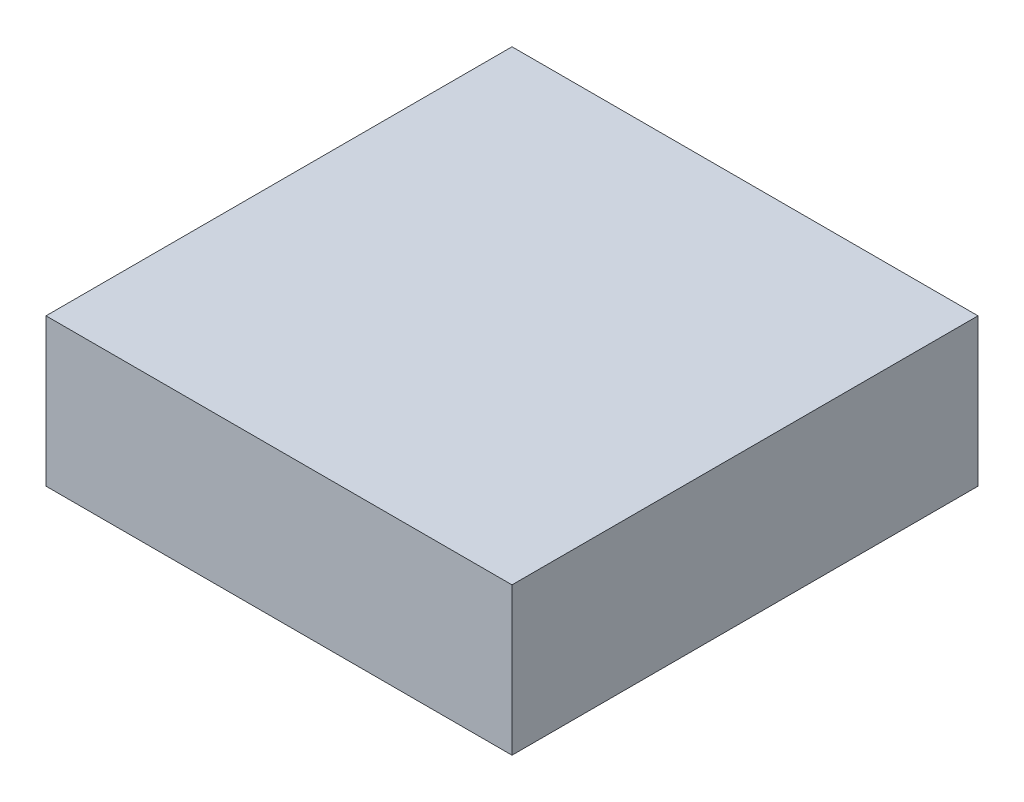
ISO-10303-21;
HEADER;
FILE_DESCRIPTION(('STEP AP214'),'2;1');
FILE_NAME('part.step','',(''),(''),'','','');
FILE_SCHEMA(('AUTOMOTIVE_DESIGN { 1 0 10303 214 1 1 1 1 }'));
ENDSEC;
DATA;
#1=APPLICATION_CONTEXT('core data for automotive mechanical design processes');
#2=APPLICATION_PROTOCOL_DEFINITION('international standard','automotive_design',2000,#1);
#3=PRODUCT_CONTEXT('',#1,'mechanical');
#4=PRODUCT('Part','Part','',(#3));
#5=PRODUCT_RELATED_PRODUCT_CATEGORY('part','',(#4));
#6=PRODUCT_DEFINITION_FORMATION('','',#4);
#7=PRODUCT_DEFINITION_CONTEXT('part definition',#1,'design');
#8=PRODUCT_DEFINITION('design','',#6,#7);
#9=PRODUCT_DEFINITION_SHAPE('','',#8);
#10=(LENGTH_UNIT() NAMED_UNIT(*) SI_UNIT(.MILLI.,.METRE.));
#11=(NAMED_UNIT(*) PLANE_ANGLE_UNIT() SI_UNIT($,.RADIAN.));
#12=(NAMED_UNIT(*) SI_UNIT($,.STERADIAN.) SOLID_ANGLE_UNIT());
#13=UNCERTAINTY_MEASURE_WITH_UNIT(LENGTH_MEASURE(1.E-05),#10,'distance_accuracy_value','');
#14=(GEOMETRIC_REPRESENTATION_CONTEXT(3) GLOBAL_UNCERTAINTY_ASSIGNED_CONTEXT((#13)) GLOBAL_UNIT_ASSIGNED_CONTEXT((#10,
#11,#12)) REPRESENTATION_CONTEXT('',''));
#15=CARTESIAN_POINT('',(0.,0.,0.));
#16=DIRECTION('',(0.,0.,1.));
#17=DIRECTION('',(1.,0.,0.));
#18=AXIS2_PLACEMENT_3D('',#15,#16,#17);
#19=CARTESIAN_POINT('',(0.,38.,0.));
#20=DIRECTION('',(1.,0.,0.));
#21=DIRECTION('',(0.,0.,-1.));
#22=AXIS2_PLACEMENT_3D('',#19,#20,#21);
#23=PLANE('',#22);
#24=DIRECTION('',(0.,0.,1.));
#25=VECTOR('',#24,1.);
#26=CARTESIAN_POINT('',(0.,0.,0.));
#27=LINE('',#26,#25);
#28=CARTESIAN_POINT('',(0.,0.,-120.));
#29=VERTEX_POINT('',#28);
#30=CARTESIAN_POINT('',(0.,0.,0.));
#31=VERTEX_POINT('',#30);
#32=EDGE_CURVE('E96',#29,#31,#27,.T.);
#33=ORIENTED_EDGE('',*,*,#32,.T.);
#34=DIRECTION('',(0.,-1.,0.));
#35=VECTOR('',#34,1.);
#36=CARTESIAN_POINT('',(0.,38.,0.));
#37=LINE('',#36,#35);
#38=CARTESIAN_POINT('',(0.,38.,0.));
#39=VERTEX_POINT('',#38);
#40=EDGE_CURVE('E11',#39,#31,#37,.T.);
#41=ORIENTED_EDGE('',*,*,#40,.F.);
#42=DIRECTION('',(0.,0.,1.));
#43=VECTOR('',#42,1.);
#44=CARTESIAN_POINT('',(0.,38.,0.));
#45=LINE('',#44,#43);
#46=CARTESIAN_POINT('',(0.,38.,-120.));
#47=VERTEX_POINT('',#46);
#48=EDGE_CURVE('E84',#47,#39,#45,.T.);
#49=ORIENTED_EDGE('',*,*,#48,.F.);
#50=DIRECTION('',(0.,-1.,0.));
#51=VECTOR('',#50,1.);
#52=CARTESIAN_POINT('',(0.,38.,-120.));
#53=LINE('',#52,#51);
#54=EDGE_CURVE('E92',#47,#29,#53,.T.);
#55=ORIENTED_EDGE('',*,*,#54,.T.);
#56=EDGE_LOOP('',(#33,#41,#49,#55));
#57=FACE_BOUND('',#56,.T.);
#58=ADVANCED_FACE('F33',(#57),#23,.F.);
#59=CARTESIAN_POINT('',(0.,38.,0.));
#60=DIRECTION('',(0.,0.,-1.));
#61=DIRECTION('',(-1.,0.,0.));
#62=AXIS2_PLACEMENT_3D('',#59,#60,#61);
#63=PLANE('',#62);
#64=DIRECTION('',(1.,0.,0.));
#65=VECTOR('',#64,1.);
#66=CARTESIAN_POINT('',(0.,0.,0.));
#67=LINE('',#66,#65);
#68=CARTESIAN_POINT('',(120.,0.,0.));
#69=VERTEX_POINT('',#68);
#70=EDGE_CURVE('E88',#31,#69,#67,.T.);
#71=ORIENTED_EDGE('',*,*,#70,.T.);
#72=DIRECTION('',(0.,-1.,0.));
#73=VECTOR('',#72,1.);
#74=CARTESIAN_POINT('',(120.,38.,0.));
#75=LINE('',#74,#73);
#76=CARTESIAN_POINT('',(120.,38.,0.));
#77=VERTEX_POINT('',#76);
#78=EDGE_CURVE('E41',#77,#69,#75,.T.);
#79=ORIENTED_EDGE('',*,*,#78,.F.);
#80=DIRECTION('',(1.,0.,0.));
#81=VECTOR('',#80,1.);
#82=CARTESIAN_POINT('',(0.,38.,0.));
#83=LINE('',#82,#81);
#84=EDGE_CURVE('E79',#39,#77,#83,.T.);
#85=ORIENTED_EDGE('',*,*,#84,.F.);
#86=ORIENTED_EDGE('',*,*,#40,.T.);
#87=EDGE_LOOP('',(#71,#79,#85,#86));
#88=FACE_BOUND('',#87,.T.);
#89=ADVANCED_FACE('F87',(#88),#63,.F.);
#90=CARTESIAN_POINT('',(120.,38.,0.));
#91=DIRECTION('',(-1.,0.,0.));
#92=DIRECTION('',(0.,0.,1.));
#93=AXIS2_PLACEMENT_3D('',#90,#91,#92);
#94=PLANE('',#93);
#95=DIRECTION('',(0.,0.,-1.));
#96=VECTOR('',#95,1.);
#97=CARTESIAN_POINT('',(120.,0.,0.));
#98=LINE('',#97,#96);
#99=CARTESIAN_POINT('',(120.,0.,-120.));
#100=VERTEX_POINT('',#99);
#101=EDGE_CURVE('E66',#69,#100,#98,.T.);
#102=ORIENTED_EDGE('',*,*,#101,.T.);
#103=DIRECTION('',(0.,-1.,0.));
#104=VECTOR('',#103,1.);
#105=CARTESIAN_POINT('',(120.,38.,-120.));
#106=LINE('',#105,#104);
#107=CARTESIAN_POINT('',(120.,38.,-120.));
#108=VERTEX_POINT('',#107);
#109=EDGE_CURVE('E89',#108,#100,#106,.T.);
#110=ORIENTED_EDGE('',*,*,#109,.F.);
#111=DIRECTION('',(0.,0.,-1.));
#112=VECTOR('',#111,1.);
#113=CARTESIAN_POINT('',(120.,38.,0.));
#114=LINE('',#113,#112);
#115=EDGE_CURVE('E82',#77,#108,#114,.T.);
#116=ORIENTED_EDGE('',*,*,#115,.F.);
#117=ORIENTED_EDGE('',*,*,#78,.T.);
#118=EDGE_LOOP('',(#102,#110,#116,#117));
#119=FACE_BOUND('',#118,.T.);
#120=ADVANCED_FACE('F90',(#119),#94,.F.);
#121=CARTESIAN_POINT('',(0.,38.,-120.));
#122=DIRECTION('',(0.,0.,1.));
#123=DIRECTION('',(1.,0.,0.));
#124=AXIS2_PLACEMENT_3D('',#121,#122,#123);
#125=PLANE('',#124);
#126=DIRECTION('',(-1.,0.,0.));
#127=VECTOR('',#126,1.);
#128=CARTESIAN_POINT('',(0.,0.,-120.));
#129=LINE('',#128,#127);
#130=EDGE_CURVE('E72',#100,#29,#129,.T.);
#131=ORIENTED_EDGE('',*,*,#130,.T.);
#132=ORIENTED_EDGE('',*,*,#54,.F.);
#133=DIRECTION('',(-1.,0.,0.));
#134=VECTOR('',#133,1.);
#135=CARTESIAN_POINT('',(0.,38.,-120.));
#136=LINE('',#135,#134);
#137=EDGE_CURVE('E49',#108,#47,#136,.T.);
#138=ORIENTED_EDGE('',*,*,#137,.F.);
#139=ORIENTED_EDGE('',*,*,#109,.T.);
#140=EDGE_LOOP('',(#131,#132,#138,#139));
#141=FACE_BOUND('',#140,.T.);
#142=ADVANCED_FACE('F103',(#141),#125,.F.);
#143=CARTESIAN_POINT('',(0.,38.,0.));
#144=DIRECTION('',(0.,-1.,0.));
#145=DIRECTION('',(0.,0.,-1.));
#146=AXIS2_PLACEMENT_3D('',#143,#144,#145);
#147=PLANE('',#146);
#148=ORIENTED_EDGE('',*,*,#48,.T.);
#149=ORIENTED_EDGE('',*,*,#84,.T.);
#150=ORIENTED_EDGE('',*,*,#115,.T.);
#151=ORIENTED_EDGE('',*,*,#137,.T.);
#152=EDGE_LOOP('',(#148,#149,#150,#151));
#153=FACE_BOUND('',#152,.T.);
#154=ADVANCED_FACE('F80',(#153),#147,.F.);
#155=CARTESIAN_POINT('',(0.,0.,0.));
#156=DIRECTION('',(0.,-1.,0.));
#157=DIRECTION('',(0.,0.,-1.));
#158=AXIS2_PLACEMENT_3D('',#155,#156,#157);
#159=PLANE('',#158);
#160=ORIENTED_EDGE('',*,*,#32,.F.);
#161=ORIENTED_EDGE('',*,*,#130,.F.);
#162=ORIENTED_EDGE('',*,*,#101,.F.);
#163=ORIENTED_EDGE('',*,*,#70,.F.);
#164=EDGE_LOOP('',(#160,#161,#162,#163));
#165=FACE_BOUND('',#164,.T.);
#166=ADVANCED_FACE('F106',(#165),#159,.T.);
#167=CLOSED_SHELL('',(#58,#89,#120,#142,#154,#166));
#168=MANIFOLD_SOLID_BREP('B2',#167);
#169=ADVANCED_BREP_SHAPE_REPRESENTATION('',(#18,#168),#14);
#170=SHAPE_DEFINITION_REPRESENTATION(#9,#169);
ENDSEC;
END-ISO-10303-21;
